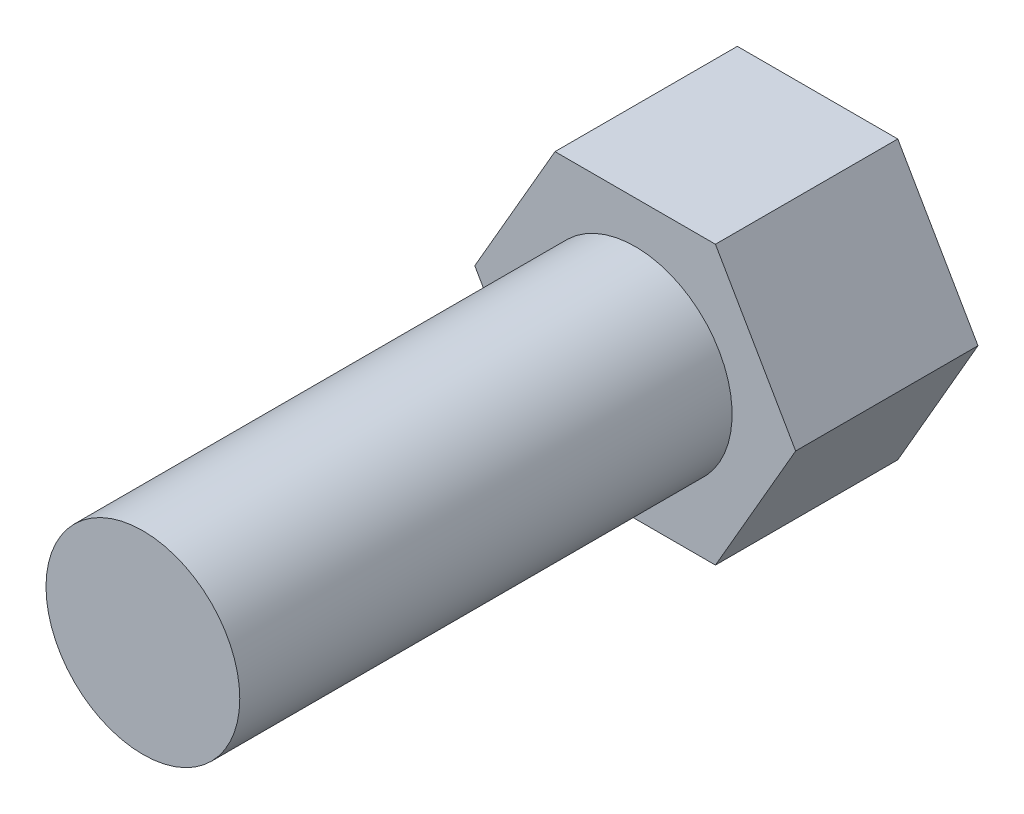
ISO-10303-21;
HEADER;
FILE_DESCRIPTION(('STEP AP214'),'2;1');
FILE_NAME('part.step','',(''),(''),'','','');
FILE_SCHEMA(('AUTOMOTIVE_DESIGN { 1 0 10303 214 1 1 1 1 }'));
ENDSEC;
DATA;
#1=APPLICATION_CONTEXT('core data for automotive mechanical design processes');
#2=APPLICATION_PROTOCOL_DEFINITION('international standard','automotive_design',2000,#1);
#3=PRODUCT_CONTEXT('',#1,'mechanical');
#4=PRODUCT('Part','Part','',(#3));
#5=PRODUCT_RELATED_PRODUCT_CATEGORY('part','',(#4));
#6=PRODUCT_DEFINITION_FORMATION('','',#4);
#7=PRODUCT_DEFINITION_CONTEXT('part definition',#1,'design');
#8=PRODUCT_DEFINITION('design','',#6,#7);
#9=PRODUCT_DEFINITION_SHAPE('','',#8);
#10=(LENGTH_UNIT() NAMED_UNIT(*) SI_UNIT(.MILLI.,.METRE.));
#11=(NAMED_UNIT(*) PLANE_ANGLE_UNIT() SI_UNIT($,.RADIAN.));
#12=(NAMED_UNIT(*) SI_UNIT($,.STERADIAN.) SOLID_ANGLE_UNIT());
#13=UNCERTAINTY_MEASURE_WITH_UNIT(LENGTH_MEASURE(1.E-05),#10,'distance_accuracy_value','');
#14=(GEOMETRIC_REPRESENTATION_CONTEXT(3) GLOBAL_UNCERTAINTY_ASSIGNED_CONTEXT((#13)) GLOBAL_UNIT_ASSIGNED_CONTEXT((#10,
#11,#12)) REPRESENTATION_CONTEXT('',''));
#15=CARTESIAN_POINT('',(0.,0.,0.));
#16=DIRECTION('',(0.,0.,1.));
#17=DIRECTION('',(1.,0.,0.));
#18=AXIS2_PLACEMENT_3D('',#15,#16,#17);
#19=CARTESIAN_POINT('',(-6.85799999999999,97.1644690745924,1.5));
#20=DIRECTION('',(0.,0.,-1.));
#21=DIRECTION('',(-1.,0.,0.));
#22=AXIS2_PLACEMENT_3D('',#19,#20,#21);
#23=PLANE('',#22);
#24=DIRECTION('',(0.5,0.866025403784439,0.));
#25=VECTOR('',#24,1.);
#26=CARTESIAN_POINT('',(-4.65829547438753,100.974469074592,1.5));
#27=LINE('',#26,#25);
#28=CARTESIAN_POINT('',(-4.65829547438753,100.974469074592,1.5));
#29=VERTEX_POINT('',#28);
#30=CARTESIAN_POINT('',(-2.45859094877506,104.784469074592,1.5));
#31=VERTEX_POINT('',#30);
#32=EDGE_CURVE('E93',#29,#31,#27,.T.);
#33=ORIENTED_EDGE('',*,*,#32,.T.);
#34=DIRECTION('',(-0.5,0.866025403784439,0.));
#35=VECTOR('',#34,1.);
#36=CARTESIAN_POINT('',(-2.45859094877506,104.784469074592,1.5));
#37=LINE('',#36,#35);
#38=CARTESIAN_POINT('',(-4.65829547438753,108.594469074592,1.5));
#39=VERTEX_POINT('',#38);
#40=EDGE_CURVE('E101',#31,#39,#37,.T.);
#41=ORIENTED_EDGE('',*,*,#40,.T.);
#42=DIRECTION('',(-1.,0.,0.));
#43=VECTOR('',#42,1.);
#44=CARTESIAN_POINT('',(-4.65829547438753,108.594469074592,1.5));
#45=LINE('',#44,#43);
#46=CARTESIAN_POINT('',(-9.05770452561249,108.594469074592,1.5));
#47=VERTEX_POINT('',#46);
#48=EDGE_CURVE('E106',#39,#47,#45,.T.);
#49=ORIENTED_EDGE('',*,*,#48,.T.);
#50=DIRECTION('',(-0.5,-0.866025403784439,0.));
#51=VECTOR('',#50,1.);
#52=CARTESIAN_POINT('',(-9.05770452561249,108.594469074592,1.5));
#53=LINE('',#52,#51);
#54=CARTESIAN_POINT('',(-11.2574090512249,104.784469074592,1.5));
#55=VERTEX_POINT('',#54);
#56=EDGE_CURVE('E118',#47,#55,#53,.T.);
#57=ORIENTED_EDGE('',*,*,#56,.T.);
#58=DIRECTION('',(0.5,-0.866025403784438,0.));
#59=VECTOR('',#58,1.);
#60=CARTESIAN_POINT('',(-11.2574090512249,104.784469074592,1.5));
#61=LINE('',#60,#59);
#62=CARTESIAN_POINT('',(-9.05770452561247,100.974469074592,1.5));
#63=VERTEX_POINT('',#62);
#64=EDGE_CURVE('E121',#55,#63,#61,.T.);
#65=ORIENTED_EDGE('',*,*,#64,.T.);
#66=DIRECTION('',(1.,0.,0.));
#67=VECTOR('',#66,1.);
#68=CARTESIAN_POINT('',(-9.05770452561247,100.974469074592,1.5));
#69=LINE('',#68,#67);
#70=EDGE_CURVE('E111',#63,#29,#69,.T.);
#71=ORIENTED_EDGE('',*,*,#70,.T.);
#72=EDGE_LOOP('',(#33,#41,#49,#57,#65,#71));
#73=FACE_BOUND('',#72,.T.);
#74=CARTESIAN_POINT('',(-6.858,104.784469074592,1.5));
#75=DIRECTION('',(0.,0.,-1.));
#76=DIRECTION('',(-1.,0.,0.));
#77=AXIS2_PLACEMENT_3D('',#74,#75,#76);
#78=CIRCLE('',#77,2.65683551649061);
#79=CARTESIAN_POINT('',(-9.51483551649061,104.784469074592,1.5));
#80=VERTEX_POINT('',#79);
#81=EDGE_CURVE('E11',#80,#80,#78,.F.);
#82=ORIENTED_EDGE('',*,*,#81,.F.);
#83=EDGE_LOOP('',(#82));
#84=FACE_BOUND('',#83,.T.);
#85=ADVANCED_FACE('F39',(#73,#84),#23,.F.);
#86=CARTESIAN_POINT('',(-4.65829547438753,100.974469074592,-3.5));
#87=DIRECTION('',(0.866025403784439,-0.5,0.));
#88=DIRECTION('',(0.5,0.866025403784439,0.));
#89=AXIS2_PLACEMENT_3D('',#86,#87,#88);
#90=PLANE('',#89);
#91=DIRECTION('',(0.,0.,1.));
#92=VECTOR('',#91,1.);
#93=CARTESIAN_POINT('',(-2.45859094877506,104.784469074592,-3.5));
#94=LINE('',#93,#92);
#95=CARTESIAN_POINT('',(-2.45859094877506,104.784469074592,-3.5));
#96=VERTEX_POINT('',#95);
#97=EDGE_CURVE('E90',#96,#31,#94,.T.);
#98=ORIENTED_EDGE('',*,*,#97,.T.);
#99=ORIENTED_EDGE('',*,*,#32,.F.);
#100=DIRECTION('',(0.,0.,1.));
#101=VECTOR('',#100,1.);
#102=CARTESIAN_POINT('',(-4.65829547438753,100.974469074592,-3.5));
#103=LINE('',#102,#101);
#104=CARTESIAN_POINT('',(-4.65829547438753,100.974469074592,-3.5));
#105=VERTEX_POINT('',#104);
#106=EDGE_CURVE('E47',#105,#29,#103,.T.);
#107=ORIENTED_EDGE('',*,*,#106,.F.);
#108=DIRECTION('',(0.5,0.866025403784439,0.));
#109=VECTOR('',#108,1.);
#110=CARTESIAN_POINT('',(-4.65829547438753,100.974469074592,-3.5));
#111=LINE('',#110,#109);
#112=EDGE_CURVE('E94',#105,#96,#111,.T.);
#113=ORIENTED_EDGE('',*,*,#112,.T.);
#114=EDGE_LOOP('',(#98,#99,#107,#113));
#115=FACE_BOUND('',#114,.T.);
#116=ADVANCED_FACE('F41',(#115),#90,.T.);
#117=CARTESIAN_POINT('',(-9.05770452561247,100.974469074592,-3.5));
#118=DIRECTION('',(0.,-1.,0.));
#119=DIRECTION('',(0.,0.,-1.));
#120=AXIS2_PLACEMENT_3D('',#117,#118,#119);
#121=PLANE('',#120);
#122=ORIENTED_EDGE('',*,*,#106,.T.);
#123=ORIENTED_EDGE('',*,*,#70,.F.);
#124=DIRECTION('',(0.,0.,1.));
#125=VECTOR('',#124,1.);
#126=CARTESIAN_POINT('',(-9.05770452561247,100.974469074592,-3.5));
#127=LINE('',#126,#125);
#128=CARTESIAN_POINT('',(-9.05770452561247,100.974469074592,-3.5));
#129=VERTEX_POINT('',#128);
#130=EDGE_CURVE('E61',#129,#63,#127,.T.);
#131=ORIENTED_EDGE('',*,*,#130,.F.);
#132=DIRECTION('',(1.,0.,0.));
#133=VECTOR('',#132,1.);
#134=CARTESIAN_POINT('',(-9.05770452561247,100.974469074592,-3.5));
#135=LINE('',#134,#133);
#136=EDGE_CURVE('E99',#129,#105,#135,.T.);
#137=ORIENTED_EDGE('',*,*,#136,.T.);
#138=EDGE_LOOP('',(#122,#123,#131,#137));
#139=FACE_BOUND('',#138,.T.);
#140=ADVANCED_FACE('F156',(#139),#121,.T.);
#141=CARTESIAN_POINT('',(-11.2574090512249,104.784469074592,-3.5));
#142=DIRECTION('',(-0.866025403784438,-0.5,0.));
#143=DIRECTION('',(0.5,-0.866025403784438,0.));
#144=AXIS2_PLACEMENT_3D('',#141,#142,#143);
#145=PLANE('',#144);
#146=ORIENTED_EDGE('',*,*,#130,.T.);
#147=ORIENTED_EDGE('',*,*,#64,.F.);
#148=DIRECTION('',(0.,0.,1.));
#149=VECTOR('',#148,1.);
#150=CARTESIAN_POINT('',(-11.2574090512249,104.784469074592,-3.5));
#151=LINE('',#150,#149);
#152=CARTESIAN_POINT('',(-11.2574090512249,104.784469074592,-3.5));
#153=VERTEX_POINT('',#152);
#154=EDGE_CURVE('E138',#153,#55,#151,.T.);
#155=ORIENTED_EDGE('',*,*,#154,.F.);
#156=DIRECTION('',(0.5,-0.866025403784438,0.));
#157=VECTOR('',#156,1.);
#158=CARTESIAN_POINT('',(-11.2574090512249,104.784469074592,-3.5));
#159=LINE('',#158,#157);
#160=EDGE_CURVE('E133',#153,#129,#159,.T.);
#161=ORIENTED_EDGE('',*,*,#160,.T.);
#162=EDGE_LOOP('',(#146,#147,#155,#161));
#163=FACE_BOUND('',#162,.T.);
#164=ADVANCED_FACE('F152',(#163),#145,.T.);
#165=CARTESIAN_POINT('',(-9.05770452561249,108.594469074592,-3.5));
#166=DIRECTION('',(-0.866025403784439,0.5,0.));
#167=DIRECTION('',(-0.5,-0.866025403784439,0.));
#168=AXIS2_PLACEMENT_3D('',#165,#166,#167);
#169=PLANE('',#168);
#170=ORIENTED_EDGE('',*,*,#154,.T.);
#171=ORIENTED_EDGE('',*,*,#56,.F.);
#172=DIRECTION('',(0.,0.,1.));
#173=VECTOR('',#172,1.);
#174=CARTESIAN_POINT('',(-9.05770452561249,108.594469074592,-3.5));
#175=LINE('',#174,#173);
#176=CARTESIAN_POINT('',(-9.05770452561249,108.594469074592,-3.5));
#177=VERTEX_POINT('',#176);
#178=EDGE_CURVE('E140',#177,#47,#175,.T.);
#179=ORIENTED_EDGE('',*,*,#178,.F.);
#180=DIRECTION('',(-0.5,-0.866025403784439,0.));
#181=VECTOR('',#180,1.);
#182=CARTESIAN_POINT('',(-9.05770452561249,108.594469074592,-3.5));
#183=LINE('',#182,#181);
#184=EDGE_CURVE('E130',#177,#153,#183,.T.);
#185=ORIENTED_EDGE('',*,*,#184,.T.);
#186=EDGE_LOOP('',(#170,#171,#179,#185));
#187=FACE_BOUND('',#186,.T.);
#188=ADVANCED_FACE('F149',(#187),#169,.T.);
#189=CARTESIAN_POINT('',(-4.65829547438753,108.594469074592,-3.5));
#190=DIRECTION('',(0.,1.,0.));
#191=DIRECTION('',(0.,0.,1.));
#192=AXIS2_PLACEMENT_3D('',#189,#190,#191);
#193=PLANE('',#192);
#194=ORIENTED_EDGE('',*,*,#178,.T.);
#195=ORIENTED_EDGE('',*,*,#48,.F.);
#196=DIRECTION('',(0.,0.,1.));
#197=VECTOR('',#196,1.);
#198=CARTESIAN_POINT('',(-4.65829547438753,108.594469074592,-3.5));
#199=LINE('',#198,#197);
#200=CARTESIAN_POINT('',(-4.65829547438753,108.594469074592,-3.5));
#201=VERTEX_POINT('',#200);
#202=EDGE_CURVE('E98',#201,#39,#199,.T.);
#203=ORIENTED_EDGE('',*,*,#202,.F.);
#204=DIRECTION('',(-1.,0.,0.));
#205=VECTOR('',#204,1.);
#206=CARTESIAN_POINT('',(-4.65829547438753,108.594469074592,-3.5));
#207=LINE('',#206,#205);
#208=EDGE_CURVE('E127',#201,#177,#207,.T.);
#209=ORIENTED_EDGE('',*,*,#208,.T.);
#210=EDGE_LOOP('',(#194,#195,#203,#209));
#211=FACE_BOUND('',#210,.T.);
#212=ADVANCED_FACE('F143',(#211),#193,.T.);
#213=CARTESIAN_POINT('',(-2.45859094877506,104.784469074592,-3.5));
#214=DIRECTION('',(0.866025403784439,0.5,0.));
#215=DIRECTION('',(-0.5,0.866025403784439,0.));
#216=AXIS2_PLACEMENT_3D('',#213,#214,#215);
#217=PLANE('',#216);
#218=ORIENTED_EDGE('',*,*,#202,.T.);
#219=ORIENTED_EDGE('',*,*,#40,.F.);
#220=ORIENTED_EDGE('',*,*,#97,.F.);
#221=DIRECTION('',(-0.5,0.866025403784439,0.));
#222=VECTOR('',#221,1.);
#223=CARTESIAN_POINT('',(-2.45859094877506,104.784469074592,-3.5));
#224=LINE('',#223,#222);
#225=EDGE_CURVE('E125',#96,#201,#224,.T.);
#226=ORIENTED_EDGE('',*,*,#225,.T.);
#227=EDGE_LOOP('',(#218,#219,#220,#226));
#228=FACE_BOUND('',#227,.T.);
#229=ADVANCED_FACE('F102',(#228),#217,.T.);
#230=CARTESIAN_POINT('',(-6.85799999999999,97.1644690745924,-3.5));
#231=DIRECTION('',(0.,0.,-1.));
#232=DIRECTION('',(-1.,0.,0.));
#233=AXIS2_PLACEMENT_3D('',#230,#231,#232);
#234=PLANE('',#233);
#235=ORIENTED_EDGE('',*,*,#112,.F.);
#236=ORIENTED_EDGE('',*,*,#136,.F.);
#237=ORIENTED_EDGE('',*,*,#160,.F.);
#238=ORIENTED_EDGE('',*,*,#184,.F.);
#239=ORIENTED_EDGE('',*,*,#208,.F.);
#240=ORIENTED_EDGE('',*,*,#225,.F.);
#241=EDGE_LOOP('',(#235,#236,#237,#238,#239,#240));
#242=FACE_BOUND('',#241,.T.);
#243=ADVANCED_FACE('F155',(#242),#234,.T.);
#244=CARTESIAN_POINT('',(-6.858,104.784469074592,15.));
#245=DIRECTION('',(0.,0.,-1.));
#246=DIRECTION('',(-1.,0.,0.));
#247=AXIS2_PLACEMENT_3D('',#244,#245,#246);
#248=CYLINDRICAL_SURFACE('',#247,2.65683551649061);
#249=CARTESIAN_POINT('',(-6.858,104.784469074592,15.));
#250=DIRECTION('',(0.,0.,1.));
#251=DIRECTION('',(1.,0.,0.));
#252=AXIS2_PLACEMENT_3D('',#249,#250,#251);
#253=CIRCLE('',#252,2.65683551649061);
#254=CARTESIAN_POINT('',(-4.2011644835094,104.784469074592,15.));
#255=VERTEX_POINT('',#254);
#256=EDGE_CURVE('E112',#255,#255,#253,.T.);
#257=ORIENTED_EDGE('',*,*,#256,.F.);
#258=EDGE_LOOP('',(#257));
#259=FACE_BOUND('',#258,.T.);
#260=ORIENTED_EDGE('',*,*,#81,.T.);
#261=EDGE_LOOP('',(#260));
#262=FACE_BOUND('',#261,.T.);
#263=ADVANCED_FACE('F170',(#259,#262),#248,.T.);
#264=CARTESIAN_POINT('',(-6.858,104.784469074592,15.));
#265=DIRECTION('',(0.,0.,1.));
#266=DIRECTION('',(1.,0.,0.));
#267=AXIS2_PLACEMENT_3D('',#264,#265,#266);
#268=PLANE('',#267);
#269=ORIENTED_EDGE('',*,*,#256,.T.);
#270=EDGE_LOOP('',(#269));
#271=FACE_BOUND('',#270,.T.);
#272=ADVANCED_FACE('F177',(#271),#268,.T.);
#273=CLOSED_SHELL('',(#85,#116,#140,#164,#188,#212,#229,#243,#263,#272));
#274=MANIFOLD_SOLID_BREP('B2',#273);
#275=ADVANCED_BREP_SHAPE_REPRESENTATION('',(#18,#274),#14);
#276=SHAPE_DEFINITION_REPRESENTATION(#9,#275);
ENDSEC;
END-ISO-10303-21;
